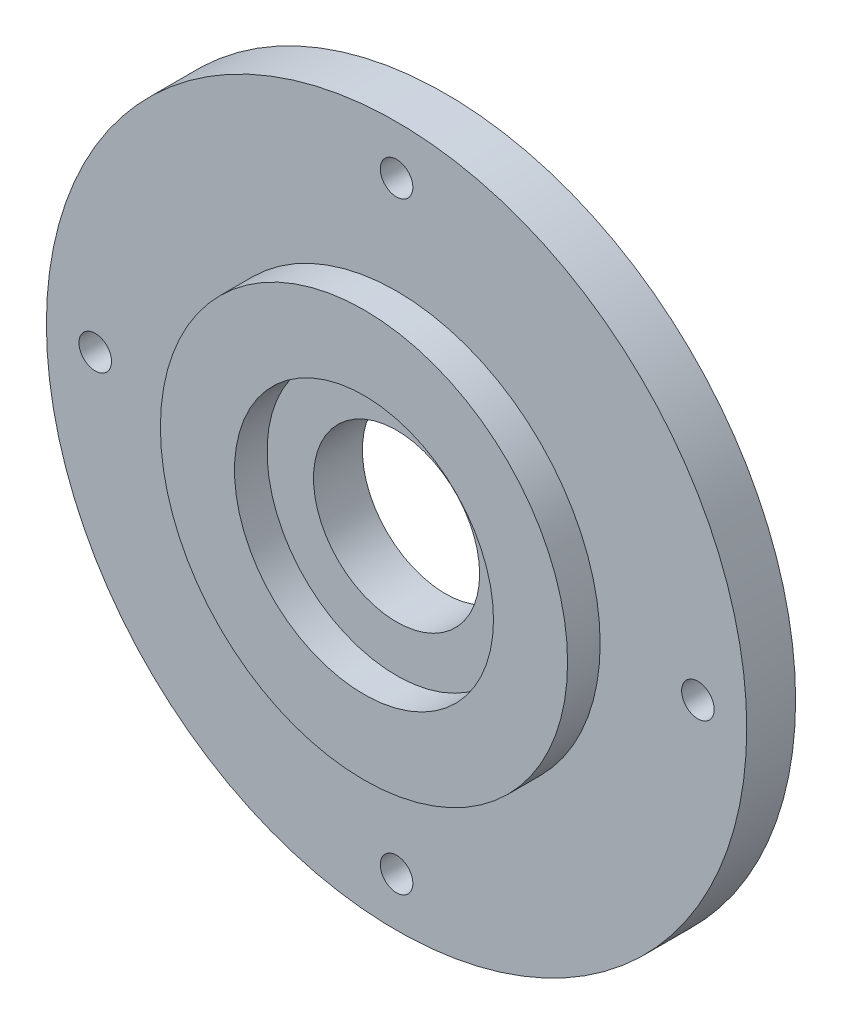
ISO-10303-21;
HEADER;
FILE_DESCRIPTION(('STEP AP214'),'2;1');
FILE_NAME('part.step','',(''),(''),'','','');
FILE_SCHEMA(('AUTOMOTIVE_DESIGN { 1 0 10303 214 1 1 1 1 }'));
ENDSEC;
DATA;
#1=APPLICATION_CONTEXT('core data for automotive mechanical design processes');
#2=APPLICATION_PROTOCOL_DEFINITION('international standard','automotive_design',2000,#1);
#3=PRODUCT_CONTEXT('',#1,'mechanical');
#4=PRODUCT('Part','Part','',(#3));
#5=PRODUCT_RELATED_PRODUCT_CATEGORY('part','',(#4));
#6=PRODUCT_DEFINITION_FORMATION('','',#4);
#7=PRODUCT_DEFINITION_CONTEXT('part definition',#1,'design');
#8=PRODUCT_DEFINITION('design','',#6,#7);
#9=PRODUCT_DEFINITION_SHAPE('','',#8);
#10=(LENGTH_UNIT() NAMED_UNIT(*) SI_UNIT(.MILLI.,.METRE.));
#11=(NAMED_UNIT(*) PLANE_ANGLE_UNIT() SI_UNIT($,.RADIAN.));
#12=(NAMED_UNIT(*) SI_UNIT($,.STERADIAN.) SOLID_ANGLE_UNIT());
#13=UNCERTAINTY_MEASURE_WITH_UNIT(LENGTH_MEASURE(1.E-05),#10,'distance_accuracy_value','');
#14=(GEOMETRIC_REPRESENTATION_CONTEXT(3) GLOBAL_UNCERTAINTY_ASSIGNED_CONTEXT((#13)) GLOBAL_UNIT_ASSIGNED_CONTEXT((#10,
#11,#12)) REPRESENTATION_CONTEXT('',''));
#15=CARTESIAN_POINT('',(0.,0.,0.));
#16=DIRECTION('',(0.,0.,1.));
#17=DIRECTION('',(1.,0.,0.));
#18=AXIS2_PLACEMENT_3D('',#15,#16,#17);
#19=CARTESIAN_POINT('',(0.,0.,6.));
#20=DIRECTION('',(0.,0.,1.));
#21=DIRECTION('',(1.,0.,0.));
#22=AXIS2_PLACEMENT_3D('',#19,#20,#21);
#23=PLANE('',#22);
#24=CARTESIAN_POINT('',(0.,0.,6.));
#25=DIRECTION('',(0.,0.,1.));
#26=DIRECTION('',(1.,0.,0.));
#27=AXIS2_PLACEMENT_3D('',#24,#25,#26);
#28=CIRCLE('',#27,10.2);
#29=CARTESIAN_POINT('',(10.2,0.,6.));
#30=VERTEX_POINT('',#29);
#31=EDGE_CURVE('E49',#30,#30,#28,.T.);
#32=ORIENTED_EDGE('',*,*,#31,.F.);
#33=EDGE_LOOP('',(#32));
#34=FACE_BOUND('',#33,.T.);
#35=CARTESIAN_POINT('',(0.,0.,6.));
#36=DIRECTION('',(0.,0.,1.));
#37=DIRECTION('',(1.,0.,0.));
#38=AXIS2_PLACEMENT_3D('',#35,#36,#37);
#39=CIRCLE('',#38,15.9);
#40=CARTESIAN_POINT('',(15.9,0.,6.));
#41=VERTEX_POINT('',#40);
#42=EDGE_CURVE('E10',#41,#41,#39,.F.);
#43=ORIENTED_EDGE('',*,*,#42,.F.);
#44=EDGE_LOOP('',(#43));
#45=FACE_BOUND('',#44,.T.);
#46=ADVANCED_FACE('F33',(#34,#45),#23,.T.);
#47=CARTESIAN_POINT('',(0.,0.,6.));
#48=DIRECTION('',(0.,0.,1.));
#49=DIRECTION('',(1.,0.,0.));
#50=AXIS2_PLACEMENT_3D('',#47,#48,#49);
#51=CIRCLE('',#50,25.);
#52=CARTESIAN_POINT('',(25.,0.,6.));
#53=VERTEX_POINT('',#52);
#54=EDGE_CURVE('E124',#53,#53,#51,.T.);
#55=ORIENTED_EDGE('',*,*,#54,.F.);
#56=EDGE_LOOP('',(#55));
#57=FACE_BOUND('',#56,.T.);
#58=CARTESIAN_POINT('',(0.,37.,6.));
#59=DIRECTION('',(0.,0.,1.));
#60=DIRECTION('',(1.,0.,0.));
#61=AXIS2_PLACEMENT_3D('',#58,#59,#60);
#62=CIRCLE('',#61,2.);
#63=CARTESIAN_POINT('',(2.,37.,6.));
#64=VERTEX_POINT('',#63);
#65=EDGE_CURVE('E79',#64,#64,#62,.T.);
#66=ORIENTED_EDGE('',*,*,#65,.F.);
#67=EDGE_LOOP('',(#66));
#68=FACE_BOUND('',#67,.T.);
#69=CARTESIAN_POINT('',(0.,-37.,6.));
#70=DIRECTION('',(0.,0.,1.));
#71=DIRECTION('',(1.,0.,0.));
#72=AXIS2_PLACEMENT_3D('',#69,#70,#71);
#73=CIRCLE('',#72,2.);
#74=CARTESIAN_POINT('',(2.,-37.,6.));
#75=VERTEX_POINT('',#74);
#76=EDGE_CURVE('E40',#75,#75,#73,.T.);
#77=ORIENTED_EDGE('',*,*,#76,.F.);
#78=EDGE_LOOP('',(#77));
#79=FACE_BOUND('',#78,.T.);
#80=CARTESIAN_POINT('',(-37.,0.,6.));
#81=DIRECTION('',(0.,0.,1.));
#82=DIRECTION('',(1.,0.,0.));
#83=AXIS2_PLACEMENT_3D('',#80,#81,#82);
#84=CIRCLE('',#83,2.);
#85=CARTESIAN_POINT('',(-35.,0.,6.));
#86=VERTEX_POINT('',#85);
#87=EDGE_CURVE('E85',#86,#86,#84,.T.);
#88=ORIENTED_EDGE('',*,*,#87,.F.);
#89=EDGE_LOOP('',(#88));
#90=FACE_BOUND('',#89,.T.);
#91=CARTESIAN_POINT('',(37.,0.,6.));
#92=DIRECTION('',(0.,0.,1.));
#93=DIRECTION('',(1.,0.,0.));
#94=AXIS2_PLACEMENT_3D('',#91,#92,#93);
#95=CIRCLE('',#94,2.);
#96=CARTESIAN_POINT('',(39.,0.,6.));
#97=VERTEX_POINT('',#96);
#98=EDGE_CURVE('E70',#97,#97,#95,.T.);
#99=ORIENTED_EDGE('',*,*,#98,.F.);
#100=EDGE_LOOP('',(#99));
#101=FACE_BOUND('',#100,.T.);
#102=CARTESIAN_POINT('',(0.,0.,6.));
#103=DIRECTION('',(0.,0.,1.));
#104=DIRECTION('',(1.,0.,0.));
#105=AXIS2_PLACEMENT_3D('',#102,#103,#104);
#106=CIRCLE('',#105,43.);
#107=CARTESIAN_POINT('',(43.,0.,6.));
#108=VERTEX_POINT('',#107);
#109=EDGE_CURVE('E134',#108,#108,#106,.T.);
#110=ORIENTED_EDGE('',*,*,#109,.T.);
#111=EDGE_LOOP('',(#110));
#112=FACE_BOUND('',#111,.T.);
#113=ADVANCED_FACE('F111',(#57,#68,#79,#90,#101,#112),#23,.T.);
#114=CARTESIAN_POINT('',(0.,0.,0.));
#115=DIRECTION('',(0.,0.,1.));
#116=DIRECTION('',(1.,0.,0.));
#117=AXIS2_PLACEMENT_3D('',#114,#115,#116);
#118=PLANE('',#117);
#119=CARTESIAN_POINT('',(19.7989898732233,4.24264068711928,0.));
#120=DIRECTION('',(0.,0.,1.));
#121=DIRECTION('',(1.,0.,0.));
#122=AXIS2_PLACEMENT_3D('',#119,#120,#121);
#123=CIRCLE('',#122,1.65);
#124=CARTESIAN_POINT('',(21.4489898732233,4.24264068711928,0.));
#125=VERTEX_POINT('',#124);
#126=EDGE_CURVE('E64',#125,#125,#123,.T.);
#127=ORIENTED_EDGE('',*,*,#126,.T.);
#128=EDGE_LOOP('',(#127));
#129=FACE_BOUND('',#128,.T.);
#130=CARTESIAN_POINT('',(4.2426406871193,19.7989898732233,0.));
#131=DIRECTION('',(0.,0.,1.));
#132=DIRECTION('',(1.,0.,0.));
#133=AXIS2_PLACEMENT_3D('',#130,#131,#132);
#134=CIRCLE('',#133,1.65);
#135=CARTESIAN_POINT('',(5.89264068711929,19.7989898732233,0.));
#136=VERTEX_POINT('',#135);
#137=EDGE_CURVE('E62',#136,#136,#134,.T.);
#138=ORIENTED_EDGE('',*,*,#137,.T.);
#139=EDGE_LOOP('',(#138));
#140=FACE_BOUND('',#139,.T.);
#141=CARTESIAN_POINT('',(-19.7989898732233,-4.24264068711929,0.));
#142=DIRECTION('',(0.,0.,1.));
#143=DIRECTION('',(1.,0.,0.));
#144=AXIS2_PLACEMENT_3D('',#141,#142,#143);
#145=CIRCLE('',#144,1.65);
#146=CARTESIAN_POINT('',(-18.1489898732233,-4.24264068711929,0.));
#147=VERTEX_POINT('',#146);
#148=EDGE_CURVE('E58',#147,#147,#145,.T.);
#149=ORIENTED_EDGE('',*,*,#148,.T.);
#150=EDGE_LOOP('',(#149));
#151=FACE_BOUND('',#150,.T.);
#152=CARTESIAN_POINT('',(-4.24264068711928,-19.7989898732233,0.));
#153=DIRECTION('',(0.,0.,1.));
#154=DIRECTION('',(1.,0.,0.));
#155=AXIS2_PLACEMENT_3D('',#152,#153,#154);
#156=CIRCLE('',#155,1.65);
#157=CARTESIAN_POINT('',(-2.59264068711928,-19.7989898732233,0.));
#158=VERTEX_POINT('',#157);
#159=EDGE_CURVE('E55',#158,#158,#156,.T.);
#160=ORIENTED_EDGE('',*,*,#159,.T.);
#161=EDGE_LOOP('',(#160));
#162=FACE_BOUND('',#161,.T.);
#163=CARTESIAN_POINT('',(0.,-37.,0.));
#164=DIRECTION('',(0.,0.,1.));
#165=DIRECTION('',(1.,0.,0.));
#166=AXIS2_PLACEMENT_3D('',#163,#164,#165);
#167=CIRCLE('',#166,2.);
#168=CARTESIAN_POINT('',(2.,-37.,0.));
#169=VERTEX_POINT('',#168);
#170=EDGE_CURVE('E44',#169,#169,#167,.T.);
#171=ORIENTED_EDGE('',*,*,#170,.T.);
#172=EDGE_LOOP('',(#171));
#173=FACE_BOUND('',#172,.T.);
#174=CARTESIAN_POINT('',(0.,0.,0.));
#175=DIRECTION('',(0.,0.,1.));
#176=DIRECTION('',(1.,0.,0.));
#177=AXIS2_PLACEMENT_3D('',#174,#175,#176);
#178=CIRCLE('',#177,10.2);
#179=CARTESIAN_POINT('',(10.2,0.,0.));
#180=VERTEX_POINT('',#179);
#181=EDGE_CURVE('E52',#180,#180,#178,.T.);
#182=ORIENTED_EDGE('',*,*,#181,.T.);
#183=EDGE_LOOP('',(#182));
#184=FACE_BOUND('',#183,.T.);
#185=CARTESIAN_POINT('',(-37.,0.,0.));
#186=DIRECTION('',(0.,0.,1.));
#187=DIRECTION('',(1.,0.,0.));
#188=AXIS2_PLACEMENT_3D('',#185,#186,#187);
#189=CIRCLE('',#188,2.);
#190=CARTESIAN_POINT('',(-35.,0.,0.));
#191=VERTEX_POINT('',#190);
#192=EDGE_CURVE('E82',#191,#191,#189,.T.);
#193=ORIENTED_EDGE('',*,*,#192,.T.);
#194=EDGE_LOOP('',(#193));
#195=FACE_BOUND('',#194,.T.);
#196=CARTESIAN_POINT('',(0.,37.,0.));
#197=DIRECTION('',(0.,0.,1.));
#198=DIRECTION('',(1.,0.,0.));
#199=AXIS2_PLACEMENT_3D('',#196,#197,#198);
#200=CIRCLE('',#199,2.);
#201=CARTESIAN_POINT('',(2.,37.,0.));
#202=VERTEX_POINT('',#201);
#203=EDGE_CURVE('E75',#202,#202,#200,.T.);
#204=ORIENTED_EDGE('',*,*,#203,.T.);
#205=EDGE_LOOP('',(#204));
#206=FACE_BOUND('',#205,.T.);
#207=CARTESIAN_POINT('',(37.,0.,0.));
#208=DIRECTION('',(0.,0.,1.));
#209=DIRECTION('',(1.,0.,0.));
#210=AXIS2_PLACEMENT_3D('',#207,#208,#209);
#211=CIRCLE('',#210,2.);
#212=CARTESIAN_POINT('',(39.,0.,0.));
#213=VERTEX_POINT('',#212);
#214=EDGE_CURVE('E66',#213,#213,#211,.T.);
#215=ORIENTED_EDGE('',*,*,#214,.T.);
#216=EDGE_LOOP('',(#215));
#217=FACE_BOUND('',#216,.T.);
#218=CARTESIAN_POINT('',(0.,0.,0.));
#219=DIRECTION('',(0.,0.,1.));
#220=DIRECTION('',(1.,0.,0.));
#221=AXIS2_PLACEMENT_3D('',#218,#219,#220);
#222=CIRCLE('',#221,43.);
#223=CARTESIAN_POINT('',(43.,0.,0.));
#224=VERTEX_POINT('',#223);
#225=EDGE_CURVE('E136',#224,#224,#222,.F.);
#226=ORIENTED_EDGE('',*,*,#225,.T.);
#227=EDGE_LOOP('',(#226));
#228=FACE_BOUND('',#227,.T.);
#229=ADVANCED_FACE('F35',(#129,#140,#151,#162,#173,#184,#195,#206,#217,#228),#118,.F.);
#230=CARTESIAN_POINT('',(0.,-37.,6.));
#231=DIRECTION('',(0.,0.,-1.));
#232=DIRECTION('',(-1.,0.,0.));
#233=AXIS2_PLACEMENT_3D('',#230,#231,#232);
#234=CYLINDRICAL_SURFACE('',#233,2.);
#235=ORIENTED_EDGE('',*,*,#76,.T.);
#236=EDGE_LOOP('',(#235));
#237=FACE_BOUND('',#236,.T.);
#238=ORIENTED_EDGE('',*,*,#170,.F.);
#239=EDGE_LOOP('',(#238));
#240=FACE_BOUND('',#239,.T.);
#241=ADVANCED_FACE('F100',(#237,#240),#234,.F.);
#242=CARTESIAN_POINT('',(0.,0.,6.));
#243=DIRECTION('',(0.,0.,-1.));
#244=DIRECTION('',(-1.,0.,0.));
#245=AXIS2_PLACEMENT_3D('',#242,#243,#244);
#246=CYLINDRICAL_SURFACE('',#245,10.2);
#247=ORIENTED_EDGE('',*,*,#31,.T.);
#248=EDGE_LOOP('',(#247));
#249=FACE_BOUND('',#248,.T.);
#250=ORIENTED_EDGE('',*,*,#181,.F.);
#251=EDGE_LOOP('',(#250));
#252=FACE_BOUND('',#251,.T.);
#253=ADVANCED_FACE('F97',(#249,#252),#246,.F.);
#254=CARTESIAN_POINT('',(-37.,0.,6.));
#255=DIRECTION('',(0.,0.,-1.));
#256=DIRECTION('',(-1.,0.,0.));
#257=AXIS2_PLACEMENT_3D('',#254,#255,#256);
#258=CYLINDRICAL_SURFACE('',#257,2.);
#259=ORIENTED_EDGE('',*,*,#87,.T.);
#260=EDGE_LOOP('',(#259));
#261=FACE_BOUND('',#260,.T.);
#262=ORIENTED_EDGE('',*,*,#192,.F.);
#263=EDGE_LOOP('',(#262));
#264=FACE_BOUND('',#263,.T.);
#265=ADVANCED_FACE('F99',(#261,#264),#258,.F.);
#266=CARTESIAN_POINT('',(0.,37.,6.));
#267=DIRECTION('',(0.,0.,-1.));
#268=DIRECTION('',(-1.,0.,0.));
#269=AXIS2_PLACEMENT_3D('',#266,#267,#268);
#270=CYLINDRICAL_SURFACE('',#269,2.);
#271=ORIENTED_EDGE('',*,*,#65,.T.);
#272=EDGE_LOOP('',(#271));
#273=FACE_BOUND('',#272,.T.);
#274=ORIENTED_EDGE('',*,*,#203,.F.);
#275=EDGE_LOOP('',(#274));
#276=FACE_BOUND('',#275,.T.);
#277=ADVANCED_FACE('F106',(#273,#276),#270,.F.);
#278=CARTESIAN_POINT('',(37.,0.,6.));
#279=DIRECTION('',(0.,0.,-1.));
#280=DIRECTION('',(-1.,0.,0.));
#281=AXIS2_PLACEMENT_3D('',#278,#279,#280);
#282=CYLINDRICAL_SURFACE('',#281,2.);
#283=ORIENTED_EDGE('',*,*,#98,.T.);
#284=EDGE_LOOP('',(#283));
#285=FACE_BOUND('',#284,.T.);
#286=ORIENTED_EDGE('',*,*,#214,.F.);
#287=EDGE_LOOP('',(#286));
#288=FACE_BOUND('',#287,.T.);
#289=ADVANCED_FACE('F165',(#285,#288),#282,.F.);
#290=CARTESIAN_POINT('',(-4.24264068711928,-19.7989898732233,6.));
#291=DIRECTION('',(0.,0.,-1.));
#292=DIRECTION('',(-1.,0.,0.));
#293=AXIS2_PLACEMENT_3D('',#290,#291,#292);
#294=CYLINDRICAL_SURFACE('',#293,1.65);
#295=CARTESIAN_POINT('',(-4.24264068711928,-19.7989898732233,6.));
#296=DIRECTION('',(0.,0.,-1.));
#297=DIRECTION('',(-1.,0.,0.));
#298=AXIS2_PLACEMENT_3D('',#295,#296,#297);
#299=CIRCLE('',#298,1.65);
#300=CARTESIAN_POINT('',(-5.89264068711928,-19.7989898732233,6.));
#301=VERTEX_POINT('',#300);
#302=EDGE_CURVE('E147',#301,#301,#299,.T.);
#303=ORIENTED_EDGE('',*,*,#302,.F.);
#304=EDGE_LOOP('',(#303));
#305=FACE_BOUND('',#304,.T.);
#306=ORIENTED_EDGE('',*,*,#159,.F.);
#307=EDGE_LOOP('',(#306));
#308=FACE_BOUND('',#307,.T.);
#309=ADVANCED_FACE('F161',(#305,#308),#294,.F.);
#310=CARTESIAN_POINT('',(-19.7989898732233,-4.24264068711929,6.));
#311=DIRECTION('',(0.,0.,-1.));
#312=DIRECTION('',(-1.,0.,0.));
#313=AXIS2_PLACEMENT_3D('',#310,#311,#312);
#314=CYLINDRICAL_SURFACE('',#313,1.65);
#315=CARTESIAN_POINT('',(-19.7989898732233,-4.24264068711929,6.));
#316=DIRECTION('',(0.,0.,-1.));
#317=DIRECTION('',(-1.,0.,0.));
#318=AXIS2_PLACEMENT_3D('',#315,#316,#317);
#319=CIRCLE('',#318,1.65);
#320=CARTESIAN_POINT('',(-21.4489898732233,-4.24264068711929,6.));
#321=VERTEX_POINT('',#320);
#322=EDGE_CURVE('E154',#321,#321,#319,.T.);
#323=ORIENTED_EDGE('',*,*,#322,.F.);
#324=EDGE_LOOP('',(#323));
#325=FACE_BOUND('',#324,.T.);
#326=ORIENTED_EDGE('',*,*,#148,.F.);
#327=EDGE_LOOP('',(#326));
#328=FACE_BOUND('',#327,.T.);
#329=ADVANCED_FACE('F164',(#325,#328),#314,.F.);
#330=CARTESIAN_POINT('',(4.2426406871193,19.7989898732233,6.));
#331=DIRECTION('',(0.,0.,-1.));
#332=DIRECTION('',(-1.,0.,0.));
#333=AXIS2_PLACEMENT_3D('',#330,#331,#332);
#334=CYLINDRICAL_SURFACE('',#333,1.65);
#335=CARTESIAN_POINT('',(4.2426406871193,19.7989898732233,6.));
#336=DIRECTION('',(0.,0.,-1.));
#337=DIRECTION('',(-1.,0.,0.));
#338=AXIS2_PLACEMENT_3D('',#335,#336,#337);
#339=CIRCLE('',#338,1.65);
#340=CARTESIAN_POINT('',(2.5926406871193,19.7989898732233,6.));
#341=VERTEX_POINT('',#340);
#342=EDGE_CURVE('E151',#341,#341,#339,.T.);
#343=ORIENTED_EDGE('',*,*,#342,.F.);
#344=EDGE_LOOP('',(#343));
#345=FACE_BOUND('',#344,.T.);
#346=ORIENTED_EDGE('',*,*,#137,.F.);
#347=EDGE_LOOP('',(#346));
#348=FACE_BOUND('',#347,.T.);
#349=ADVANCED_FACE('F176',(#345,#348),#334,.F.);
#350=CARTESIAN_POINT('',(19.7989898732233,4.24264068711928,6.));
#351=DIRECTION('',(0.,0.,-1.));
#352=DIRECTION('',(-1.,0.,0.));
#353=AXIS2_PLACEMENT_3D('',#350,#351,#352);
#354=CYLINDRICAL_SURFACE('',#353,1.65);
#355=CARTESIAN_POINT('',(19.7989898732233,4.24264068711928,6.));
#356=DIRECTION('',(0.,0.,-1.));
#357=DIRECTION('',(-1.,0.,0.));
#358=AXIS2_PLACEMENT_3D('',#355,#356,#357);
#359=CIRCLE('',#358,1.65);
#360=CARTESIAN_POINT('',(18.1489898732233,4.24264068711928,6.));
#361=VERTEX_POINT('',#360);
#362=EDGE_CURVE('E59',#361,#361,#359,.T.);
#363=ORIENTED_EDGE('',*,*,#362,.F.);
#364=EDGE_LOOP('',(#363));
#365=FACE_BOUND('',#364,.T.);
#366=ORIENTED_EDGE('',*,*,#126,.F.);
#367=EDGE_LOOP('',(#366));
#368=FACE_BOUND('',#367,.T.);
#369=ADVANCED_FACE('F215',(#365,#368),#354,.F.);
#370=CARTESIAN_POINT('',(0.,0.,6.));
#371=DIRECTION('',(0.,0.,1.));
#372=DIRECTION('',(1.,0.,0.));
#373=AXIS2_PLACEMENT_3D('',#370,#371,#372);
#374=PLANE('',#373);
#375=ORIENTED_EDGE('',*,*,#362,.T.);
#376=EDGE_LOOP('',(#375));
#377=FACE_BOUND('',#376,.T.);
#378=ADVANCED_FACE('F211',(#377),#374,.F.);
#379=ORIENTED_EDGE('',*,*,#342,.T.);
#380=EDGE_LOOP('',(#379));
#381=FACE_BOUND('',#380,.T.);
#382=ADVANCED_FACE('F230',(#381),#374,.F.);
#383=ORIENTED_EDGE('',*,*,#322,.T.);
#384=EDGE_LOOP('',(#383));
#385=FACE_BOUND('',#384,.T.);
#386=ADVANCED_FACE('F210',(#385),#374,.F.);
#387=ORIENTED_EDGE('',*,*,#302,.T.);
#388=EDGE_LOOP('',(#387));
#389=FACE_BOUND('',#388,.T.);
#390=ADVANCED_FACE('F159',(#389),#374,.F.);
#391=CARTESIAN_POINT('',(0.,0.,10.));
#392=DIRECTION('',(0.,0.,1.));
#393=DIRECTION('',(1.,0.,0.));
#394=AXIS2_PLACEMENT_3D('',#391,#392,#393);
#395=PLANE('',#394);
#396=CARTESIAN_POINT('',(0.,0.,10.));
#397=DIRECTION('',(0.,0.,1.));
#398=DIRECTION('',(1.,0.,0.));
#399=AXIS2_PLACEMENT_3D('',#396,#397,#398);
#400=CIRCLE('',#399,25.);
#401=CARTESIAN_POINT('',(25.,0.,10.));
#402=VERTEX_POINT('',#401);
#403=EDGE_CURVE('E144',#402,#402,#400,.T.);
#404=ORIENTED_EDGE('',*,*,#403,.T.);
#405=EDGE_LOOP('',(#404));
#406=FACE_BOUND('',#405,.T.);
#407=CARTESIAN_POINT('',(0.,0.,10.));
#408=DIRECTION('',(0.,0.,1.));
#409=DIRECTION('',(1.,0.,0.));
#410=AXIS2_PLACEMENT_3D('',#407,#408,#409);
#411=CIRCLE('',#410,15.9);
#412=CARTESIAN_POINT('',(15.9,0.,10.));
#413=VERTEX_POINT('',#412);
#414=EDGE_CURVE('E139',#413,#413,#411,.T.);
#415=ORIENTED_EDGE('',*,*,#414,.F.);
#416=EDGE_LOOP('',(#415));
#417=FACE_BOUND('',#416,.T.);
#418=ADVANCED_FACE('F204',(#406,#417),#395,.T.);
#419=CARTESIAN_POINT('',(0.,0.,10.));
#420=DIRECTION('',(0.,0.,-1.));
#421=DIRECTION('',(-1.,0.,0.));
#422=AXIS2_PLACEMENT_3D('',#419,#420,#421);
#423=CYLINDRICAL_SURFACE('',#422,25.);
#424=ORIENTED_EDGE('',*,*,#403,.F.);
#425=EDGE_LOOP('',(#424));
#426=FACE_BOUND('',#425,.T.);
#427=ORIENTED_EDGE('',*,*,#54,.T.);
#428=EDGE_LOOP('',(#427));
#429=FACE_BOUND('',#428,.T.);
#430=ADVANCED_FACE('F200',(#426,#429),#423,.T.);
#431=CARTESIAN_POINT('',(0.,0.,10.));
#432=DIRECTION('',(0.,0.,-1.));
#433=DIRECTION('',(-1.,0.,0.));
#434=AXIS2_PLACEMENT_3D('',#431,#432,#433);
#435=CYLINDRICAL_SURFACE('',#434,15.9);
#436=ORIENTED_EDGE('',*,*,#414,.T.);
#437=EDGE_LOOP('',(#436));
#438=FACE_BOUND('',#437,.T.);
#439=ORIENTED_EDGE('',*,*,#42,.T.);
#440=EDGE_LOOP('',(#439));
#441=FACE_BOUND('',#440,.T.);
#442=ADVANCED_FACE('F195',(#438,#441),#435,.F.);
#443=CARTESIAN_POINT('',(0.,0.,-121.622366364086));
#444=DIRECTION('',(0.,0.,1.));
#445=DIRECTION('',(1.,0.,0.));
#446=AXIS2_PLACEMENT_3D('',#443,#444,#445);
#447=CYLINDRICAL_SURFACE('',#446,43.);
#448=ORIENTED_EDGE('',*,*,#225,.F.);
#449=EDGE_LOOP('',(#448));
#450=FACE_BOUND('',#449,.T.);
#451=ORIENTED_EDGE('',*,*,#109,.F.);
#452=EDGE_LOOP('',(#451));
#453=FACE_BOUND('',#452,.T.);
#454=ADVANCED_FACE('F193',(#450,#453),#447,.T.);
#455=CLOSED_SHELL('',(#46,#113,#229,#241,#253,#265,#277,#289,#309,#329,#349,#369,#378,#382,#386,
#390,#418,#430,#442,#454));
#456=MANIFOLD_SOLID_BREP('B2',#455);
#457=ADVANCED_BREP_SHAPE_REPRESENTATION('',(#18,#456),#14);
#458=SHAPE_DEFINITION_REPRESENTATION(#9,#457);
ENDSEC;
END-ISO-10303-21;
